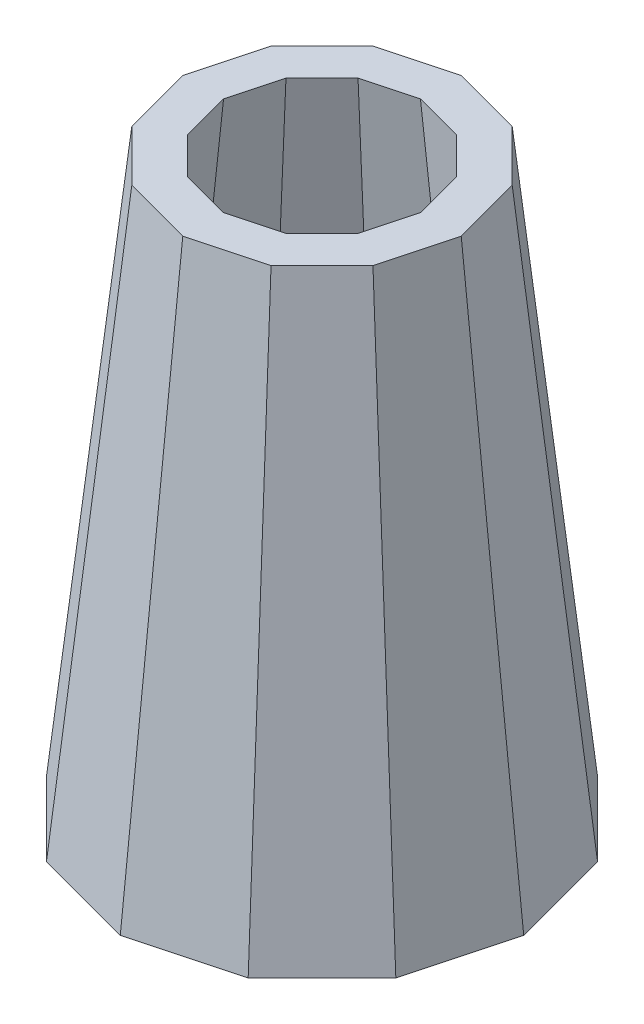
ISO-10303-21;
HEADER;
FILE_DESCRIPTION(('STEP AP214'),'2;1');
FILE_NAME('part.step','',(''),(''),'','','');
FILE_SCHEMA(('AUTOMOTIVE_DESIGN { 1 0 10303 214 1 1 1 1 }'));
ENDSEC;
DATA;
#1=APPLICATION_CONTEXT('core data for automotive mechanical design processes');
#2=APPLICATION_PROTOCOL_DEFINITION('international standard','automotive_design',2000,#1);
#3=PRODUCT_CONTEXT('',#1,'mechanical');
#4=PRODUCT('Part','Part','',(#3));
#5=PRODUCT_RELATED_PRODUCT_CATEGORY('part','',(#4));
#6=PRODUCT_DEFINITION_FORMATION('','',#4);
#7=PRODUCT_DEFINITION_CONTEXT('part definition',#1,'design');
#8=PRODUCT_DEFINITION('design','',#6,#7);
#9=PRODUCT_DEFINITION_SHAPE('','',#8);
#10=(LENGTH_UNIT() NAMED_UNIT(*) SI_UNIT(.MILLI.,.METRE.));
#11=(NAMED_UNIT(*) PLANE_ANGLE_UNIT() SI_UNIT($,.RADIAN.));
#12=(NAMED_UNIT(*) SI_UNIT($,.STERADIAN.) SOLID_ANGLE_UNIT());
#13=UNCERTAINTY_MEASURE_WITH_UNIT(LENGTH_MEASURE(1.E-05),#10,'distance_accuracy_value','');
#14=(GEOMETRIC_REPRESENTATION_CONTEXT(3) GLOBAL_UNCERTAINTY_ASSIGNED_CONTEXT((#13)) GLOBAL_UNIT_ASSIGNED_CONTEXT((#10,
#11,#12)) REPRESENTATION_CONTEXT('',''));
#15=CARTESIAN_POINT('',(0.,0.,0.));
#16=DIRECTION('',(0.,0.,1.));
#17=DIRECTION('',(1.,0.,0.));
#18=AXIS2_PLACEMENT_3D('',#15,#16,#17);
#19=CARTESIAN_POINT('',(84.9900564597618,0.,49.0690319754837));
#20=DIRECTION('',(0.960634383546173,0.104528463267653,0.257401207292754));
#21=DIRECTION('',(0.25881904510251,0.,-0.965925826289071));
#22=AXIS2_PLACEMENT_3D('',#19,#20,#21);
#23=PLANE('',#22);
#24=DIRECTION('',(0.25881904510251,0.,-0.965925826289071));
#25=VECTOR('',#24,1.);
#26=CARTESIAN_POINT('',(84.9900564597618,0.,49.0690319754837));
#27=LINE('',#26,#25);
#28=CARTESIAN_POINT('',(84.9900564597618,0.,49.0690319754837));
#29=VERTEX_POINT('',#28);
#30=CARTESIAN_POINT('',(98.1380639509693,0.,-1.08940634291343E-12));
#31=VERTEX_POINT('',#30);
#32=EDGE_CURVE('E288',#29,#31,#27,.T.);
#33=ORIENTED_EDGE('',*,*,#32,.T.);
#34=DIRECTION('',(0.108173407342293,-0.994132040497618,0.));
#35=VECTOR('',#34,1.);
#36=CARTESIAN_POINT('',(98.1380639509693,0.,-1.08940634291343E-12));
#37=LINE('',#36,#35);
#38=CARTESIAN_POINT('',(67.7360159530915,279.4,-7.45644531443626E-13));
#39=VERTEX_POINT('',#38);
#40=EDGE_CURVE('E11',#39,#31,#37,.T.);
#41=ORIENTED_EDGE('',*,*,#40,.F.);
#42=DIRECTION('',(-0.25881904510251,0.,0.965925826289071));
#43=VECTOR('',#42,1.);
#44=CARTESIAN_POINT('',(56.6245595142048,279.4,41.4685199760145));
#45=LINE('',#44,#43);
#46=CARTESIAN_POINT('',(58.6611105665257,279.4,33.8680079765451));
#47=VERTEX_POINT('',#46);
#48=EDGE_CURVE('E316',#47,#39,#45,.F.);
#49=ORIENTED_EDGE('',*,*,#48,.F.);
#50=DIRECTION('',(0.0936809187723488,-0.994132040497618,0.0540867036711456));
#51=VECTOR('',#50,1.);
#52=CARTESIAN_POINT('',(84.9900564597618,0.,49.0690319754837));
#53=LINE('',#52,#51);
#54=EDGE_CURVE('E318',#47,#29,#53,.T.);
#55=ORIENTED_EDGE('',*,*,#54,.T.);
#56=EDGE_LOOP('',(#33,#41,#49,#55));
#57=FACE_BOUND('',#56,.T.);
#58=ADVANCED_FACE('F35',(#57),#23,.T.);
#59=CARTESIAN_POINT('',(98.1380639509693,0.,-1.08940634291343E-12));
#60=DIRECTION('',(0.960634383546167,0.104528463267653,-0.257401207292776));
#61=DIRECTION('',(-0.258819045102531,0.,-0.965925826289065));
#62=AXIS2_PLACEMENT_3D('',#59,#60,#61);
#63=PLANE('',#62);
#64=DIRECTION('',(-0.258819045102531,0.,-0.965925826289065));
#65=VECTOR('',#64,1.);
#66=CARTESIAN_POINT('',(98.1380639509693,0.,-1.08940634291343E-12));
#67=LINE('',#66,#65);
#68=CARTESIAN_POINT('',(84.9900564597607,0.,-49.0690319754856));
#69=VERTEX_POINT('',#68);
#70=EDGE_CURVE('E291',#31,#69,#67,.T.);
#71=ORIENTED_EDGE('',*,*,#70,.T.);
#72=DIRECTION('',(0.0936809187723476,-0.994132040497618,-0.0540867036711477));
#73=VECTOR('',#72,1.);
#74=CARTESIAN_POINT('',(84.9900564597607,0.,-49.0690319754856));
#75=LINE('',#74,#73);
#76=CARTESIAN_POINT('',(58.6611105665249,279.4,-33.8680079765464));
#77=VERTEX_POINT('',#76);
#78=EDGE_CURVE('E45',#77,#69,#75,.T.);
#79=ORIENTED_EDGE('',*,*,#78,.F.);
#80=DIRECTION('',(0.258819045102531,0.,0.965925826289065));
#81=VECTOR('',#80,1.);
#82=CARTESIAN_POINT('',(69.7725670054125,279.4,7.60051199946867));
#83=LINE('',#82,#81);
#84=EDGE_CURVE('E357',#39,#77,#83,.F.);
#85=ORIENTED_EDGE('',*,*,#84,.F.);
#86=ORIENTED_EDGE('',*,*,#40,.T.);
#87=EDGE_LOOP('',(#71,#79,#85,#86));
#88=FACE_BOUND('',#87,.T.);
#89=ADVANCED_FACE('F37',(#88),#63,.T.);
#90=CARTESIAN_POINT('',(84.9900564597607,0.,-49.0690319754856));
#91=DIRECTION('',(0.703233176253396,0.104528463267653,-0.703233176253413));
#92=DIRECTION('',(-0.707106781186556,0.,-0.707106781186539));
#93=AXIS2_PLACEMENT_3D('',#90,#91,#92);
#94=PLANE('',#93);
#95=DIRECTION('',(-0.707106781186556,0.,-0.707106781186539));
#96=VECTOR('',#95,1.);
#97=CARTESIAN_POINT('',(84.9900564597607,0.,-49.0690319754856));
#98=LINE('',#97,#96);
#99=CARTESIAN_POINT('',(49.0690319754835,0.,-84.9900564597619));
#100=VERTEX_POINT('',#99);
#101=EDGE_CURVE('E294',#69,#100,#98,.T.);
#102=ORIENTED_EDGE('',*,*,#101,.T.);
#103=DIRECTION('',(0.0540867036711456,-0.994132040497618,-0.0936809187723488));
#104=VECTOR('',#103,1.);
#105=CARTESIAN_POINT('',(49.0690319754835,0.,-84.9900564597619));
#106=LINE('',#105,#104);
#107=CARTESIAN_POINT('',(33.8680079765449,279.4,-58.6611105665258));
#108=VERTEX_POINT('',#107);
#109=EDGE_CURVE('E349',#108,#100,#106,.T.);
#110=ORIENTED_EDGE('',*,*,#109,.F.);
#111=DIRECTION('',(0.707106781186556,0.,0.707106781186539));
#112=VECTOR('',#111,1.);
#113=CARTESIAN_POINT('',(64.2250715136735,279.4,-28.3040470293979));
#114=LINE('',#113,#112);
#115=EDGE_CURVE('E359',#77,#108,#114,.F.);
#116=ORIENTED_EDGE('',*,*,#115,.F.);
#117=ORIENTED_EDGE('',*,*,#78,.T.);
#118=EDGE_LOOP('',(#102,#110,#116,#117));
#119=FACE_BOUND('',#118,.T.);
#120=ADVANCED_FACE('F398',(#119),#94,.T.);
#121=CARTESIAN_POINT('',(49.0690319754835,0.,-84.9900564597619));
#122=DIRECTION('',(0.257401207292754,0.104528463267653,-0.960634383546173));
#123=DIRECTION('',(-0.965925826289071,0.,-0.25881904510251));
#124=AXIS2_PLACEMENT_3D('',#121,#122,#123);
#125=PLANE('',#124);
#126=DIRECTION('',(-0.965925826289071,0.,-0.25881904510251));
#127=VECTOR('',#126,1.);
#128=CARTESIAN_POINT('',(49.0690319754835,0.,-84.9900564597619));
#129=LINE('',#128,#127);
#130=CARTESIAN_POINT('',(-1.15194854481231E-12,0.,-98.1380639509694));
#131=VERTEX_POINT('',#130);
#132=EDGE_CURVE('E296',#100,#131,#129,.T.);
#133=ORIENTED_EDGE('',*,*,#132,.T.);
#134=DIRECTION('',(0.,-0.994132040497618,-0.108173407342293));
#135=VECTOR('',#134,1.);
#136=CARTESIAN_POINT('',(-1.15531823272913E-12,0.,-98.1380639509694));
#137=LINE('',#136,#135);
#138=CARTESIAN_POINT('',(-7.87140091823943E-13,279.4,-67.7360159530916));
#139=VERTEX_POINT('',#138);
#140=EDGE_CURVE('E346',#139,#131,#137,.T.);
#141=ORIENTED_EDGE('',*,*,#140,.F.);
#142=DIRECTION('',(0.965925826289071,0.,0.25881904510251));
#143=VECTOR('',#142,1.);
#144=CARTESIAN_POINT('',(41.4685199760144,279.4,-56.624559514205));
#145=LINE('',#144,#143);
#146=EDGE_CURVE('E361',#108,#139,#145,.F.);
#147=ORIENTED_EDGE('',*,*,#146,.F.);
#148=ORIENTED_EDGE('',*,*,#109,.T.);
#149=EDGE_LOOP('',(#133,#141,#147,#148));
#150=FACE_BOUND('',#149,.T.);
#151=ADVANCED_FACE('F402',(#150),#125,.T.);
#152=CARTESIAN_POINT('',(-1.15194854481231E-12,0.,-98.1380639509694));
#153=DIRECTION('',(-0.257401207292778,0.104528463267653,-0.960634383546167));
#154=DIRECTION('',(-0.965925826289065,0.,0.258819045102533));
#155=AXIS2_PLACEMENT_3D('',#152,#153,#154);
#156=PLANE('',#155);
#157=DIRECTION('',(-0.965925826289065,0.,0.258819045102533));
#158=VECTOR('',#157,1.);
#159=CARTESIAN_POINT('',(-1.15194854481231E-12,0.,-98.1380639509694));
#160=LINE('',#159,#158);
#161=CARTESIAN_POINT('',(-49.0690319754856,0.,-84.9900564597607));
#162=VERTEX_POINT('',#161);
#163=EDGE_CURVE('E299',#131,#162,#160,.T.);
#164=ORIENTED_EDGE('',*,*,#163,.T.);
#165=DIRECTION('',(-0.0540867036711478,-0.994132040497618,-0.0936809187723475));
#166=VECTOR('',#165,1.);
#167=CARTESIAN_POINT('',(-49.0690319754856,0.,-84.9900564597607));
#168=LINE('',#167,#166);
#169=CARTESIAN_POINT('',(-33.8680079765464,279.4,-58.6611105665249));
#170=VERTEX_POINT('',#169);
#171=EDGE_CURVE('E343',#170,#162,#168,.T.);
#172=ORIENTED_EDGE('',*,*,#171,.F.);
#173=DIRECTION('',(0.965925826289065,0.,-0.258819045102533));
#174=VECTOR('',#173,1.);
#175=CARTESIAN_POINT('',(7.60051199946865,279.4,-69.7725670054126));
#176=LINE('',#175,#174);
#177=EDGE_CURVE('E363',#139,#170,#176,.F.);
#178=ORIENTED_EDGE('',*,*,#177,.F.);
#179=ORIENTED_EDGE('',*,*,#140,.T.);
#180=EDGE_LOOP('',(#164,#172,#178,#179));
#181=FACE_BOUND('',#180,.T.);
#182=ADVANCED_FACE('F407',(#181),#156,.T.);
#183=CARTESIAN_POINT('',(-49.0690319754856,0.,-84.9900564597607));
#184=DIRECTION('',(-0.703233176253413,0.104528463267653,-0.703233176253396));
#185=DIRECTION('',(-0.707106781186539,0.,0.707106781186556));
#186=AXIS2_PLACEMENT_3D('',#183,#184,#185);
#187=PLANE('',#186);
#188=DIRECTION('',(-0.707106781186539,0.,0.707106781186556));
#189=VECTOR('',#188,1.);
#190=CARTESIAN_POINT('',(-49.0690319754856,0.,-84.9900564597607));
#191=LINE('',#190,#189);
#192=CARTESIAN_POINT('',(-84.9900564597618,0.,-49.0690319754837));
#193=VERTEX_POINT('',#192);
#194=EDGE_CURVE('E301',#162,#193,#191,.T.);
#195=ORIENTED_EDGE('',*,*,#194,.T.);
#196=DIRECTION('',(-0.0936809187723488,-0.994132040497618,-0.0540867036711456));
#197=VECTOR('',#196,1.);
#198=CARTESIAN_POINT('',(-84.9900564597618,0.,-49.0690319754837));
#199=LINE('',#198,#197);
#200=CARTESIAN_POINT('',(-58.6611105665257,279.4,-33.8680079765451));
#201=VERTEX_POINT('',#200);
#202=EDGE_CURVE('E340',#201,#193,#199,.T.);
#203=ORIENTED_EDGE('',*,*,#202,.F.);
#204=DIRECTION('',(0.707106781186539,0.,-0.707106781186556));
#205=VECTOR('',#204,1.);
#206=CARTESIAN_POINT('',(-28.3040470293979,279.4,-64.2250715136735));
#207=LINE('',#206,#205);
#208=EDGE_CURVE('E365',#170,#201,#207,.F.);
#209=ORIENTED_EDGE('',*,*,#208,.F.);
#210=ORIENTED_EDGE('',*,*,#171,.T.);
#211=EDGE_LOOP('',(#195,#203,#209,#210));
#212=FACE_BOUND('',#211,.T.);
#213=ADVANCED_FACE('F413',(#212),#187,.T.);
#214=CARTESIAN_POINT('',(-84.9900564597618,0.,-49.0690319754837));
#215=DIRECTION('',(-0.960634383546173,0.104528463267653,-0.257401207292755));
#216=DIRECTION('',(-0.25881904510251,0.,0.965925826289071));
#217=AXIS2_PLACEMENT_3D('',#214,#215,#216);
#218=PLANE('',#217);
#219=DIRECTION('',(-0.25881904510251,0.,0.965925826289071));
#220=VECTOR('',#219,1.);
#221=CARTESIAN_POINT('',(-84.9900564597618,0.,-49.0690319754837));
#222=LINE('',#221,#220);
#223=CARTESIAN_POINT('',(-98.1380639509694,0.,1.14965619313282E-12));
#224=VERTEX_POINT('',#223);
#225=EDGE_CURVE('E303',#193,#224,#222,.T.);
#226=ORIENTED_EDGE('',*,*,#225,.T.);
#227=DIRECTION('',(-0.108173407342293,-0.994132040497618,0.));
#228=VECTOR('',#227,1.);
#229=CARTESIAN_POINT('',(-98.1380639509694,0.,1.14965619313282E-12));
#230=LINE('',#229,#228);
#231=CARTESIAN_POINT('',(-67.7360159530916,279.4,8.02551515723469E-13));
#232=VERTEX_POINT('',#231);
#233=EDGE_CURVE('E336',#232,#224,#230,.T.);
#234=ORIENTED_EDGE('',*,*,#233,.F.);
#235=DIRECTION('',(0.25881904510251,0.,-0.965925826289071));
#236=VECTOR('',#235,1.);
#237=CARTESIAN_POINT('',(-56.6245595142049,279.4,-41.4685199760145));
#238=LINE('',#237,#236);
#239=EDGE_CURVE('E368',#201,#232,#238,.F.);
#240=ORIENTED_EDGE('',*,*,#239,.F.);
#241=ORIENTED_EDGE('',*,*,#202,.T.);
#242=EDGE_LOOP('',(#226,#234,#240,#241));
#243=FACE_BOUND('',#242,.T.);
#244=ADVANCED_FACE('F417',(#243),#218,.T.);
#245=CARTESIAN_POINT('',(-98.1380639509694,0.,1.14965619313282E-12));
#246=DIRECTION('',(-0.960634383546167,0.104528463267653,0.257401207292777));
#247=DIRECTION('',(0.258819045102532,0.,0.965925826289065));
#248=AXIS2_PLACEMENT_3D('',#245,#246,#247);
#249=PLANE('',#248);
#250=DIRECTION('',(0.258819045102532,0.,0.965925826289065));
#251=VECTOR('',#250,1.);
#252=CARTESIAN_POINT('',(-98.1380639509694,0.,1.14965619313282E-12));
#253=LINE('',#252,#251);
#254=CARTESIAN_POINT('',(-84.9900564597607,0.,49.0690319754856));
#255=VERTEX_POINT('',#254);
#256=EDGE_CURVE('E306',#224,#255,#253,.T.);
#257=ORIENTED_EDGE('',*,*,#256,.T.);
#258=DIRECTION('',(-0.0936809187723475,-0.994132040497618,0.0540867036711478));
#259=VECTOR('',#258,1.);
#260=CARTESIAN_POINT('',(-84.9900564597607,0.,49.0690319754856));
#261=LINE('',#260,#259);
#262=CARTESIAN_POINT('',(-58.6611105665249,279.4,33.8680079765464));
#263=VERTEX_POINT('',#262);
#264=EDGE_CURVE('E333',#263,#255,#261,.T.);
#265=ORIENTED_EDGE('',*,*,#264,.F.);
#266=DIRECTION('',(-0.258819045102532,0.,-0.965925826289065));
#267=VECTOR('',#266,1.);
#268=CARTESIAN_POINT('',(-69.7725670054126,279.4,-7.60051199946864));
#269=LINE('',#268,#267);
#270=EDGE_CURVE('E370',#232,#263,#269,.F.);
#271=ORIENTED_EDGE('',*,*,#270,.F.);
#272=ORIENTED_EDGE('',*,*,#233,.T.);
#273=EDGE_LOOP('',(#257,#265,#271,#272));
#274=FACE_BOUND('',#273,.T.);
#275=ADVANCED_FACE('F422',(#274),#249,.T.);
#276=CARTESIAN_POINT('',(-84.9900564597607,0.,49.0690319754856));
#277=DIRECTION('',(-0.703233176253396,0.104528463267653,0.703233176253412));
#278=DIRECTION('',(0.707106781186556,0.,0.707106781186539));
#279=AXIS2_PLACEMENT_3D('',#276,#277,#278);
#280=PLANE('',#279);
#281=DIRECTION('',(0.707106781186556,0.,0.707106781186539));
#282=VECTOR('',#281,1.);
#283=CARTESIAN_POINT('',(-84.9900564597607,0.,49.0690319754856));
#284=LINE('',#283,#282);
#285=CARTESIAN_POINT('',(-49.0690319754837,0.,84.9900564597618));
#286=VERTEX_POINT('',#285);
#287=EDGE_CURVE('E308',#255,#286,#284,.T.);
#288=ORIENTED_EDGE('',*,*,#287,.T.);
#289=DIRECTION('',(-0.0540867036711456,-0.994132040497618,0.0936809187723488));
#290=VECTOR('',#289,1.);
#291=CARTESIAN_POINT('',(-49.0690319754837,0.,84.9900564597618));
#292=LINE('',#291,#290);
#293=CARTESIAN_POINT('',(-33.8680079765451,279.4,58.6611105665257));
#294=VERTEX_POINT('',#293);
#295=EDGE_CURVE('E329',#294,#286,#292,.T.);
#296=ORIENTED_EDGE('',*,*,#295,.F.);
#297=DIRECTION('',(-0.707106781186556,0.,-0.707106781186539));
#298=VECTOR('',#297,1.);
#299=CARTESIAN_POINT('',(-64.2250715136735,279.4,28.3040470293979));
#300=LINE('',#299,#298);
#301=EDGE_CURVE('E372',#263,#294,#300,.F.);
#302=ORIENTED_EDGE('',*,*,#301,.F.);
#303=ORIENTED_EDGE('',*,*,#264,.T.);
#304=EDGE_LOOP('',(#288,#296,#302,#303));
#305=FACE_BOUND('',#304,.T.);
#306=ADVANCED_FACE('F428',(#305),#280,.T.);
#307=CARTESIAN_POINT('',(-49.0690319754837,0.,84.9900564597618));
#308=DIRECTION('',(-0.257401207292755,0.104528463267653,0.960634383546172));
#309=DIRECTION('',(0.965925826289071,0.,0.25881904510251));
#310=AXIS2_PLACEMENT_3D('',#307,#308,#309);
#311=PLANE('',#310);
#312=DIRECTION('',(0.965925826289071,0.,0.25881904510251));
#313=VECTOR('',#312,1.);
#314=CARTESIAN_POINT('',(-49.0690319754837,0.,84.9900564597618));
#315=LINE('',#314,#313);
#316=CARTESIAN_POINT('',(1.09077713337527E-12,0.,98.1380639509693));
#317=VERTEX_POINT('',#316);
#318=EDGE_CURVE('E310',#286,#317,#315,.T.);
#319=ORIENTED_EDGE('',*,*,#318,.T.);
#320=DIRECTION('',(0.,-0.994132040497618,0.108173407342293));
#321=VECTOR('',#320,1.);
#322=CARTESIAN_POINT('',(1.09077713337527E-12,0.,98.1380639509693));
#323=LINE('',#322,#321);
#324=CARTESIAN_POINT('',(7.54030869078314E-13,279.4,67.7360159530916));
#325=VERTEX_POINT('',#324);
#326=EDGE_CURVE('E325',#325,#317,#323,.T.);
#327=ORIENTED_EDGE('',*,*,#326,.F.);
#328=DIRECTION('',(-0.965925826289071,0.,-0.25881904510251));
#329=VECTOR('',#328,1.);
#330=CARTESIAN_POINT('',(-41.4685199760145,279.4,56.6245595142048));
#331=LINE('',#330,#329);
#332=EDGE_CURVE('E375',#294,#325,#331,.F.);
#333=ORIENTED_EDGE('',*,*,#332,.F.);
#334=ORIENTED_EDGE('',*,*,#295,.T.);
#335=EDGE_LOOP('',(#319,#327,#333,#334));
#336=FACE_BOUND('',#335,.T.);
#337=ADVANCED_FACE('F432',(#336),#311,.T.);
#338=CARTESIAN_POINT('',(1.09077713337527E-12,0.,98.1380639509693));
#339=DIRECTION('',(0.257401207292777,0.104528463267653,0.960634383546167));
#340=DIRECTION('',(0.965925826289065,0.,-0.258819045102532));
#341=AXIS2_PLACEMENT_3D('',#338,#339,#340);
#342=PLANE('',#341);
#343=DIRECTION('',(0.965925826289065,0.,-0.258819045102532));
#344=VECTOR('',#343,1.);
#345=CARTESIAN_POINT('',(1.09077713337527E-12,0.,98.1380639509693));
#346=LINE('',#345,#344);
#347=CARTESIAN_POINT('',(49.0690319754856,0.,84.9900564597607));
#348=VERTEX_POINT('',#347);
#349=EDGE_CURVE('E313',#317,#348,#346,.T.);
#350=ORIENTED_EDGE('',*,*,#349,.T.);
#351=DIRECTION('',(0.0540867036711478,-0.994132040497618,0.0936809187723475));
#352=VECTOR('',#351,1.);
#353=CARTESIAN_POINT('',(49.0690319754856,0.,84.9900564597607));
#354=LINE('',#353,#352);
#355=CARTESIAN_POINT('',(33.8680079765464,279.4,58.6611105665249));
#356=VERTEX_POINT('',#355);
#357=EDGE_CURVE('E321',#356,#348,#354,.T.);
#358=ORIENTED_EDGE('',*,*,#357,.F.);
#359=DIRECTION('',(-0.965925826289065,0.,0.258819045102532));
#360=VECTOR('',#359,1.);
#361=CARTESIAN_POINT('',(-7.60051199946869,279.4,69.7725670054125));
#362=LINE('',#361,#360);
#363=EDGE_CURVE('E377',#325,#356,#362,.F.);
#364=ORIENTED_EDGE('',*,*,#363,.F.);
#365=ORIENTED_EDGE('',*,*,#326,.T.);
#366=EDGE_LOOP('',(#350,#358,#364,#365));
#367=FACE_BOUND('',#366,.T.);
#368=ADVANCED_FACE('F435',(#367),#342,.T.);
#369=CARTESIAN_POINT('',(49.0690319754856,0.,84.9900564597607));
#370=DIRECTION('',(0.703233176253412,0.104528463267653,0.703233176253396));
#371=DIRECTION('',(0.707106781186539,0.,-0.707106781186556));
#372=AXIS2_PLACEMENT_3D('',#369,#370,#371);
#373=PLANE('',#372);
#374=DIRECTION('',(0.707106781186539,0.,-0.707106781186556));
#375=VECTOR('',#374,1.);
#376=CARTESIAN_POINT('',(49.0690319754856,0.,84.9900564597607));
#377=LINE('',#376,#375);
#378=EDGE_CURVE('E315',#348,#29,#377,.T.);
#379=ORIENTED_EDGE('',*,*,#378,.T.);
#380=ORIENTED_EDGE('',*,*,#54,.F.);
#381=DIRECTION('',(-0.707106781186539,0.,0.707106781186556));
#382=VECTOR('',#381,1.);
#383=CARTESIAN_POINT('',(28.3040470293979,279.4,64.2250715136735));
#384=LINE('',#383,#382);
#385=EDGE_CURVE('E39',#356,#47,#384,.F.);
#386=ORIENTED_EDGE('',*,*,#385,.F.);
#387=ORIENTED_EDGE('',*,*,#357,.T.);
#388=EDGE_LOOP('',(#379,#380,#386,#387));
#389=FACE_BOUND('',#388,.T.);
#390=ADVANCED_FACE('F387',(#389),#373,.T.);
#391=CARTESIAN_POINT('',(0.,279.4,0.));
#392=DIRECTION('',(0.,1.,0.));
#393=DIRECTION('',(0.,0.,1.));
#394=AXIS2_PLACEMENT_3D('',#391,#392,#393);
#395=PLANE('',#394);
#396=DIRECTION('',(-0.25881904510251,0.,0.965925826289071));
#397=VECTOR('',#396,1.);
#398=CARTESIAN_POINT('',(38.122315293636,279.4,36.5108585789499));
#399=LINE('',#398,#397);
#400=CARTESIAN_POINT('',(41.4872677136472,279.4,23.9526851824156));
#401=VERTEX_POINT('',#400);
#402=CARTESIAN_POINT('',(47.9053703648323,279.4,-5.14131474739469E-13));
#403=VERTEX_POINT('',#402);
#404=EDGE_CURVE('E227',#401,#403,#399,.F.);
#405=ORIENTED_EDGE('',*,*,#404,.F.);
#406=DIRECTION('',(-0.707106781186539,0.,0.707106781186556));
#407=VECTOR('',#406,1.);
#408=CARTESIAN_POINT('',(14.7594642058938,279.4,50.6804886901697));
#409=LINE('',#408,#407);
#410=CARTESIAN_POINT('',(23.9526851824166,279.4,41.4872677136467));
#411=VERTEX_POINT('',#410);
#412=EDGE_CURVE('E205',#411,#401,#409,.F.);
#413=ORIENTED_EDGE('',*,*,#412,.F.);
#414=DIRECTION('',(-0.965925826289065,0.,0.258819045102532));
#415=VECTOR('',#414,1.);
#416=CARTESIAN_POINT('',(-12.5581733965337,279.4,51.2703227848438));
#417=LINE('',#416,#415);
#418=CARTESIAN_POINT('',(5.22517812374158E-13,279.4,47.9053703648323));
#419=VERTEX_POINT('',#418);
#420=EDGE_CURVE('E284',#419,#411,#417,.F.);
#421=ORIENTED_EDGE('',*,*,#420,.F.);
#422=DIRECTION('',(-0.965925826289071,0.,-0.25881904510251));
#423=VECTOR('',#422,1.);
#424=CARTESIAN_POINT('',(-36.5108585789499,279.4,38.122315293636));
#425=LINE('',#424,#423);
#426=CARTESIAN_POINT('',(-23.9526851824157,279.4,41.4872677136472));
#427=VERTEX_POINT('',#426);
#428=EDGE_CURVE('E281',#427,#419,#425,.F.);
#429=ORIENTED_EDGE('',*,*,#428,.F.);
#430=DIRECTION('',(-0.707106781186556,0.,-0.707106781186539));
#431=VECTOR('',#430,1.);
#432=CARTESIAN_POINT('',(-50.6804886901697,279.4,14.7594642058938));
#433=LINE('',#432,#431);
#434=CARTESIAN_POINT('',(-41.4872677136467,279.4,23.9526851824166));
#435=VERTEX_POINT('',#434);
#436=EDGE_CURVE('E279',#435,#427,#433,.F.);
#437=ORIENTED_EDGE('',*,*,#436,.F.);
#438=DIRECTION('',(-0.258819045102532,0.,-0.965925826289065));
#439=VECTOR('',#438,1.);
#440=CARTESIAN_POINT('',(-51.2703227848438,279.4,-12.5581733965337));
#441=LINE('',#440,#439);
#442=CARTESIAN_POINT('',(-47.9053703648323,279.4,5.71038459019313E-13));
#443=VERTEX_POINT('',#442);
#444=EDGE_CURVE('E276',#443,#435,#441,.F.);
#445=ORIENTED_EDGE('',*,*,#444,.F.);
#446=DIRECTION('',(0.25881904510251,0.,-0.965925826289071));
#447=VECTOR('',#446,1.);
#448=CARTESIAN_POINT('',(-38.122315293636,279.4,-36.5108585789499));
#449=LINE('',#448,#447);
#450=CARTESIAN_POINT('',(-41.4872677136473,279.4,-23.9526851824156));
#451=VERTEX_POINT('',#450);
#452=EDGE_CURVE('E274',#451,#443,#449,.F.);
#453=ORIENTED_EDGE('',*,*,#452,.F.);
#454=DIRECTION('',(0.707106781186539,0.,-0.707106781186556));
#455=VECTOR('',#454,1.);
#456=CARTESIAN_POINT('',(-14.7594642058938,279.4,-50.6804886901697));
#457=LINE('',#456,#455);
#458=CARTESIAN_POINT('',(-23.9526851824166,279.4,-41.4872677136467));
#459=VERTEX_POINT('',#458);
#460=EDGE_CURVE('E271',#459,#451,#457,.F.);
#461=ORIENTED_EDGE('',*,*,#460,.F.);
#462=DIRECTION('',(0.965925826289065,0.,-0.258819045102533));
#463=VECTOR('',#462,1.);
#464=CARTESIAN_POINT('',(12.5581733965337,279.4,-51.2703227848439));
#465=LINE('',#464,#463);
#466=CARTESIAN_POINT('',(-5.55627035119787E-13,279.4,-47.9053703648323));
#467=VERTEX_POINT('',#466);
#468=EDGE_CURVE('E269',#467,#459,#465,.F.);
#469=ORIENTED_EDGE('',*,*,#468,.F.);
#470=DIRECTION('',(0.965925826289071,0.,0.25881904510251));
#471=VECTOR('',#470,1.);
#472=CARTESIAN_POINT('',(36.5108585789498,279.4,-38.1223152936361));
#473=LINE('',#472,#471);
#474=CARTESIAN_POINT('',(23.9526851824155,279.4,-41.4872677136473));
#475=VERTEX_POINT('',#474);
#476=EDGE_CURVE('E267',#475,#467,#473,.F.);
#477=ORIENTED_EDGE('',*,*,#476,.F.);
#478=DIRECTION('',(0.707106781186556,0.,0.707106781186539));
#479=VECTOR('',#478,1.);
#480=CARTESIAN_POINT('',(50.6804886901697,279.4,-14.7594642058938));
#481=LINE('',#480,#479);
#482=CARTESIAN_POINT('',(41.4872677136467,279.4,-23.9526851824166));
#483=VERTEX_POINT('',#482);
#484=EDGE_CURVE('E265',#483,#475,#481,.F.);
#485=ORIENTED_EDGE('',*,*,#484,.F.);
#486=DIRECTION('',(0.258819045102531,0.,0.965925826289065));
#487=VECTOR('',#486,1.);
#488=CARTESIAN_POINT('',(51.2703227848437,279.4,12.5581733965337));
#489=LINE('',#488,#487);
#490=EDGE_CURVE('E233',#403,#483,#489,.F.);
#491=ORIENTED_EDGE('',*,*,#490,.F.);
#492=EDGE_LOOP('',(#405,#413,#421,#429,#437,#445,#453,#461,#469,#477,#485,#491));
#493=FACE_BOUND('',#492,.T.);
#494=ORIENTED_EDGE('',*,*,#48,.T.);
#495=ORIENTED_EDGE('',*,*,#84,.T.);
#496=ORIENTED_EDGE('',*,*,#115,.T.);
#497=ORIENTED_EDGE('',*,*,#146,.T.);
#498=ORIENTED_EDGE('',*,*,#177,.T.);
#499=ORIENTED_EDGE('',*,*,#208,.T.);
#500=ORIENTED_EDGE('',*,*,#239,.T.);
#501=ORIENTED_EDGE('',*,*,#270,.T.);
#502=ORIENTED_EDGE('',*,*,#301,.T.);
#503=ORIENTED_EDGE('',*,*,#332,.T.);
#504=ORIENTED_EDGE('',*,*,#363,.T.);
#505=ORIENTED_EDGE('',*,*,#385,.T.);
#506=EDGE_LOOP('',(#494,#495,#496,#497,#498,#499,#500,#501,#502,#503,#504,#505));
#507=FACE_BOUND('',#506,.T.);
#508=ADVANCED_FACE('F383',(#493,#507),#395,.T.);
#509=CARTESIAN_POINT('',(0.,0.,0.));
#510=DIRECTION('',(0.,1.,0.));
#511=DIRECTION('',(0.,0.,1.));
#512=AXIS2_PLACEMENT_3D('',#509,#510,#511);
#513=PLANE('',#512);
#514=DIRECTION('',(-0.707106781186539,0.,0.707106781186556));
#515=VECTOR('',#514,1.);
#516=CARTESIAN_POINT('',(35.5244491519815,0.,71.4454736362569));
#517=LINE('',#516,#515);
#518=CARTESIAN_POINT('',(39.1537091813558,0.,67.8162136068825));
#519=VERTEX_POINT('',#518);
#520=CARTESIAN_POINT('',(67.8162136068834,0.,39.1537091813542));
#521=VERTEX_POINT('',#520);
#522=EDGE_CURVE('E202',#519,#521,#517,.F.);
#523=ORIENTED_EDGE('',*,*,#522,.T.);
#524=DIRECTION('',(-0.25881904510251,0.,0.965925826289071));
#525=VECTOR('',#524,1.);
#526=CARTESIAN_POINT('',(66.487812239193,0.,44.1113705784191));
#527=LINE('',#526,#525);
#528=CARTESIAN_POINT('',(78.30741836271,0.,-8.6686984867976E-13));
#529=VERTEX_POINT('',#528);
#530=EDGE_CURVE('E212',#521,#529,#527,.F.);
#531=ORIENTED_EDGE('',*,*,#530,.T.);
#532=DIRECTION('',(0.258819045102531,0.,0.965925826289065));
#533=VECTOR('',#532,1.);
#534=CARTESIAN_POINT('',(79.6358197304005,0.,4.95766139706393));
#535=LINE('',#534,#533);
#536=CARTESIAN_POINT('',(67.8162136068825,0.,-39.1537091813558));
#537=VERTEX_POINT('',#536);
#538=EDGE_CURVE('E219',#529,#537,#535,.F.);
#539=ORIENTED_EDGE('',*,*,#538,.T.);
#540=DIRECTION('',(0.707106781186556,0.,0.707106781186539));
#541=VECTOR('',#540,1.);
#542=CARTESIAN_POINT('',(71.4454736362569,0.,-35.5244491519815));
#543=LINE('',#542,#541);
#544=CARTESIAN_POINT('',(39.1537091813541,0.,-67.8162136068835));
#545=VERTEX_POINT('',#544);
#546=EDGE_CURVE('E61',#537,#545,#543,.F.);
#547=ORIENTED_EDGE('',*,*,#546,.T.);
#548=DIRECTION('',(0.965925826289071,0.,0.25881904510251));
#549=VECTOR('',#548,1.);
#550=CARTESIAN_POINT('',(44.1113705784189,0.,-66.4878122391931));
#551=LINE('',#550,#549);
#552=CARTESIAN_POINT('',(-9.30399512208222E-13,0.,-78.3074183627101));
#553=VERTEX_POINT('',#552);
#554=EDGE_CURVE('E256',#545,#553,#551,.F.);
#555=ORIENTED_EDGE('',*,*,#554,.T.);
#556=DIRECTION('',(0.965925826289065,0.,-0.258819045102533));
#557=VECTOR('',#556,1.);
#558=CARTESIAN_POINT('',(4.95766139706389,0.,-79.6358197304007));
#559=LINE('',#558,#557);
#560=CARTESIAN_POINT('',(-39.1537091813558,0.,-67.8162136068825));
#561=VERTEX_POINT('',#560);
#562=EDGE_CURVE('E253',#553,#561,#559,.F.);
#563=ORIENTED_EDGE('',*,*,#562,.T.);
#564=DIRECTION('',(0.707106781186539,0.,-0.707106781186556));
#565=VECTOR('',#564,1.);
#566=CARTESIAN_POINT('',(-35.5244491519815,0.,-71.4454736362569));
#567=LINE('',#566,#565);
#568=CARTESIAN_POINT('',(-67.8162136068834,0.,-39.1537091813542));
#569=VERTEX_POINT('',#568);
#570=EDGE_CURVE('E250',#561,#569,#567,.F.);
#571=ORIENTED_EDGE('',*,*,#570,.T.);
#572=DIRECTION('',(0.25881904510251,0.,-0.965925826289071));
#573=VECTOR('',#572,1.);
#574=CARTESIAN_POINT('',(-66.487812239193,0.,-44.1113705784191));
#575=LINE('',#574,#573);
#576=CARTESIAN_POINT('',(-78.3074183627101,0.,9.16327160781419E-13));
#577=VERTEX_POINT('',#576);
#578=EDGE_CURVE('E246',#569,#577,#575,.F.);
#579=ORIENTED_EDGE('',*,*,#578,.T.);
#580=DIRECTION('',(-0.258819045102532,0.,-0.965925826289065));
#581=VECTOR('',#580,1.);
#582=CARTESIAN_POINT('',(-79.6358197304006,0.,-4.95766139706389));
#583=LINE('',#582,#581);
#584=CARTESIAN_POINT('',(-67.8162136068825,0.,39.1537091813558));
#585=VERTEX_POINT('',#584);
#586=EDGE_CURVE('E243',#577,#585,#583,.F.);
#587=ORIENTED_EDGE('',*,*,#586,.T.);
#588=DIRECTION('',(-0.707106781186556,0.,-0.707106781186539));
#589=VECTOR('',#588,1.);
#590=CARTESIAN_POINT('',(-71.4454736362569,0.,35.5244491519815));
#591=LINE('',#590,#589);
#592=CARTESIAN_POINT('',(-39.1537091813542,0.,67.8162136068834));
#593=VERTEX_POINT('',#592);
#594=EDGE_CURVE('E240',#585,#593,#591,.F.);
#595=ORIENTED_EDGE('',*,*,#594,.T.);
#596=DIRECTION('',(-0.965925826289071,0.,-0.25881904510251));
#597=VECTOR('',#596,1.);
#598=CARTESIAN_POINT('',(-44.1113705784191,0.,66.487812239193));
#599=LINE('',#598,#597);
#600=CARTESIAN_POINT('',(8.66279623843966E-13,0.,78.3074183627101));
#601=VERTEX_POINT('',#600);
#602=EDGE_CURVE('E235',#593,#601,#599,.F.);
#603=ORIENTED_EDGE('',*,*,#602,.T.);
#604=DIRECTION('',(-0.965925826289065,0.,0.258819045102532));
#605=VECTOR('',#604,1.);
#606=CARTESIAN_POINT('',(-4.95766139706394,0.,79.6358197304006));
#607=LINE('',#606,#605);
#608=EDGE_CURVE('E225',#601,#519,#607,.F.);
#609=ORIENTED_EDGE('',*,*,#608,.T.);
#610=EDGE_LOOP('',(#523,#531,#539,#547,#555,#563,#571,#579,#587,#595,#603,#609));
#611=FACE_BOUND('',#610,.T.);
#612=ORIENTED_EDGE('',*,*,#32,.F.);
#613=ORIENTED_EDGE('',*,*,#378,.F.);
#614=ORIENTED_EDGE('',*,*,#349,.F.);
#615=ORIENTED_EDGE('',*,*,#318,.F.);
#616=ORIENTED_EDGE('',*,*,#287,.F.);
#617=ORIENTED_EDGE('',*,*,#256,.F.);
#618=ORIENTED_EDGE('',*,*,#225,.F.);
#619=ORIENTED_EDGE('',*,*,#194,.F.);
#620=ORIENTED_EDGE('',*,*,#163,.F.);
#621=ORIENTED_EDGE('',*,*,#132,.F.);
#622=ORIENTED_EDGE('',*,*,#101,.F.);
#623=ORIENTED_EDGE('',*,*,#70,.F.);
#624=EDGE_LOOP('',(#612,#613,#614,#615,#616,#617,#618,#619,#620,#621,#622,#623));
#625=FACE_BOUND('',#624,.T.);
#626=ADVANCED_FACE('F221',(#611,#625),#513,.F.);
#627=CARTESIAN_POINT('',(66.6899714532072,-1.9912672252488,44.1655389765567));
#628=DIRECTION('',(0.960634383546173,0.104528463267653,0.257401207292754));
#629=DIRECTION('',(0.25881904510251,0.,-0.965925826289071));
#630=AXIS2_PLACEMENT_3D('',#627,#628,#629);
#631=PLANE('',#630);
#632=ORIENTED_EDGE('',*,*,#530,.F.);
#633=DIRECTION('',(0.0936809187723488,-0.994132040497618,0.0540867036711456));
#634=VECTOR('',#633,1.);
#635=CARTESIAN_POINT('',(68.017173089555,-2.13256085853676,39.2697331927709));
#636=LINE('',#635,#634);
#637=EDGE_CURVE('E198',#401,#521,#636,.T.);
#638=ORIENTED_EDGE('',*,*,#637,.F.);
#639=ORIENTED_EDGE('',*,*,#404,.T.);
#640=DIRECTION('',(0.108173407342293,-0.994132040497618,0.));
#641=VECTOR('',#640,1.);
#642=CARTESIAN_POINT('',(78.5394663855433,-2.13256085853676,-8.70831184940357E-13));
#643=LINE('',#642,#641);
#644=EDGE_CURVE('E215',#403,#529,#643,.T.);
#645=ORIENTED_EDGE('',*,*,#644,.T.);
#646=EDGE_LOOP('',(#632,#638,#639,#645));
#647=FACE_BOUND('',#646,.T.);
#648=ADVANCED_FACE('F213',(#647),#631,.F.);
#649=CARTESIAN_POINT('',(79.8379789444148,-1.9912672252488,4.9034929989263));
#650=DIRECTION('',(0.960634383546167,0.104528463267653,-0.257401207292776));
#651=DIRECTION('',(-0.258819045102531,0.,-0.965925826289065));
#652=AXIS2_PLACEMENT_3D('',#649,#650,#651);
#653=PLANE('',#652);
#654=ORIENTED_EDGE('',*,*,#538,.F.);
#655=ORIENTED_EDGE('',*,*,#644,.F.);
#656=ORIENTED_EDGE('',*,*,#490,.T.);
#657=DIRECTION('',(0.0936809187723476,-0.994132040497618,-0.0540867036711477));
#658=VECTOR('',#657,1.);
#659=CARTESIAN_POINT('',(68.0171730895541,-2.13256085853676,-39.2697331927725));
#660=LINE('',#659,#658);
#661=EDGE_CURVE('E547',#483,#537,#660,.T.);
#662=ORIENTED_EDGE('',*,*,#661,.T.);
#663=EDGE_LOOP('',(#654,#655,#656,#662));
#664=FACE_BOUND('',#663,.T.);
#665=ADVANCED_FACE('F442',(#664),#653,.F.);
#666=CARTESIAN_POINT('',(71.5934644521335,-1.9912672252488,-35.6724399678581));
#667=DIRECTION('',(0.703233176253396,0.104528463267653,-0.703233176253413));
#668=DIRECTION('',(-0.707106781186556,0.,-0.707106781186539));
#669=AXIS2_PLACEMENT_3D('',#666,#667,#668);
#670=PLANE('',#669);
#671=ORIENTED_EDGE('',*,*,#546,.F.);
#672=ORIENTED_EDGE('',*,*,#661,.F.);
#673=ORIENTED_EDGE('',*,*,#484,.T.);
#674=DIRECTION('',(0.0540867036711456,-0.994132040497618,-0.0936809187723488));
#675=VECTOR('',#674,1.);
#676=CARTESIAN_POINT('',(39.2697331927707,-2.13256085853676,-68.0171730895551));
#677=LINE('',#676,#675);
#678=EDGE_CURVE('E530',#475,#545,#677,.T.);
#679=ORIENTED_EDGE('',*,*,#678,.T.);
#680=EDGE_LOOP('',(#671,#672,#673,#679));
#681=FACE_BOUND('',#680,.T.);
#682=ADVANCED_FACE('F605',(#681),#670,.F.);
#683=CARTESIAN_POINT('',(44.1655389765565,-1.9912672252488,-66.6899714532073));
#684=DIRECTION('',(0.257401207292754,0.104528463267653,-0.960634383546173));
#685=DIRECTION('',(-0.965925826289071,0.,-0.25881904510251));
#686=AXIS2_PLACEMENT_3D('',#683,#684,#685);
#687=PLANE('',#686);
#688=ORIENTED_EDGE('',*,*,#554,.F.);
#689=ORIENTED_EDGE('',*,*,#678,.F.);
#690=ORIENTED_EDGE('',*,*,#476,.T.);
#691=DIRECTION('',(0.,-0.994132040497618,-0.108173407342293));
#692=VECTOR('',#691,1.);
#693=CARTESIAN_POINT('',(-9.30679144861557E-13,-2.13256085853676,-78.5394663855434));
#694=LINE('',#693,#692);
#695=EDGE_CURVE('E528',#467,#553,#694,.T.);
#696=ORIENTED_EDGE('',*,*,#695,.T.);
#697=EDGE_LOOP('',(#688,#689,#690,#696));
#698=FACE_BOUND('',#697,.T.);
#699=ADVANCED_FACE('F575',(#698),#687,.F.);
#700=CARTESIAN_POINT('',(4.90349299892626,-1.9912672252488,-79.8379789444149));
#701=DIRECTION('',(-0.257401207292778,0.104528463267653,-0.960634383546167));
#702=DIRECTION('',(-0.965925826289065,0.,0.258819045102533));
#703=AXIS2_PLACEMENT_3D('',#700,#701,#702);
#704=PLANE('',#703);
#705=ORIENTED_EDGE('',*,*,#562,.F.);
#706=ORIENTED_EDGE('',*,*,#695,.F.);
#707=ORIENTED_EDGE('',*,*,#468,.T.);
#708=DIRECTION('',(-0.0540867036711478,-0.994132040497618,-0.0936809187723475));
#709=VECTOR('',#708,1.);
#710=CARTESIAN_POINT('',(-39.2697331927725,-2.13256085853676,-68.0171730895541));
#711=LINE('',#710,#709);
#712=EDGE_CURVE('E531',#459,#561,#711,.T.);
#713=ORIENTED_EDGE('',*,*,#712,.T.);
#714=EDGE_LOOP('',(#705,#706,#707,#713));
#715=FACE_BOUND('',#714,.T.);
#716=ADVANCED_FACE('F580',(#715),#704,.F.);
#717=CARTESIAN_POINT('',(-35.6724399678581,-1.9912672252488,-71.5934644521335));
#718=DIRECTION('',(-0.703233176253413,0.104528463267653,-0.703233176253396));
#719=DIRECTION('',(-0.707106781186539,0.,0.707106781186556));
#720=AXIS2_PLACEMENT_3D('',#717,#718,#719);
#721=PLANE('',#720);
#722=ORIENTED_EDGE('',*,*,#570,.F.);
#723=ORIENTED_EDGE('',*,*,#712,.F.);
#724=ORIENTED_EDGE('',*,*,#460,.T.);
#725=DIRECTION('',(-0.0936809187723488,-0.994132040497618,-0.0540867036711456));
#726=VECTOR('',#725,1.);
#727=CARTESIAN_POINT('',(-68.017173089555,-2.13256085853676,-39.2697331927709));
#728=LINE('',#727,#726);
#729=EDGE_CURVE('E543',#451,#569,#728,.T.);
#730=ORIENTED_EDGE('',*,*,#729,.T.);
#731=EDGE_LOOP('',(#722,#723,#724,#730));
#732=FACE_BOUND('',#731,.T.);
#733=ADVANCED_FACE('F585',(#732),#721,.F.);
#734=CARTESIAN_POINT('',(-66.6899714532073,-1.9912672252488,-44.1655389765567));
#735=DIRECTION('',(-0.960634383546173,0.104528463267653,-0.257401207292755));
#736=DIRECTION('',(-0.25881904510251,0.,0.965925826289071));
#737=AXIS2_PLACEMENT_3D('',#734,#735,#736);
#738=PLANE('',#737);
#739=ORIENTED_EDGE('',*,*,#578,.F.);
#740=ORIENTED_EDGE('',*,*,#729,.F.);
#741=ORIENTED_EDGE('',*,*,#452,.T.);
#742=DIRECTION('',(-0.108173407342293,-0.994132040497618,0.));
#743=VECTOR('',#742,1.);
#744=CARTESIAN_POINT('',(-78.5394663855434,-2.13256085853676,9.16801357053743E-13));
#745=LINE('',#744,#743);
#746=EDGE_CURVE('E540',#443,#577,#745,.T.);
#747=ORIENTED_EDGE('',*,*,#746,.T.);
#748=EDGE_LOOP('',(#739,#740,#741,#747));
#749=FACE_BOUND('',#748,.T.);
#750=ADVANCED_FACE('F590',(#749),#738,.F.);
#751=CARTESIAN_POINT('',(-79.8379789444149,-1.9912672252488,-4.90349299892626));
#752=DIRECTION('',(-0.960634383546167,0.104528463267653,0.257401207292777));
#753=DIRECTION('',(0.258819045102532,0.,0.965925826289065));
#754=AXIS2_PLACEMENT_3D('',#751,#752,#753);
#755=PLANE('',#754);
#756=ORIENTED_EDGE('',*,*,#586,.F.);
#757=ORIENTED_EDGE('',*,*,#746,.F.);
#758=ORIENTED_EDGE('',*,*,#444,.T.);
#759=DIRECTION('',(-0.0936809187723475,-0.994132040497618,0.0540867036711478));
#760=VECTOR('',#759,1.);
#761=CARTESIAN_POINT('',(-68.0171730895541,-2.13256085853676,39.2697331927724));
#762=LINE('',#761,#760);
#763=EDGE_CURVE('E544',#435,#585,#762,.T.);
#764=ORIENTED_EDGE('',*,*,#763,.T.);
#765=EDGE_LOOP('',(#756,#757,#758,#764));
#766=FACE_BOUND('',#765,.T.);
#767=ADVANCED_FACE('F595',(#766),#755,.F.);
#768=CARTESIAN_POINT('',(-71.5934644521335,-1.9912672252488,35.6724399678581));
#769=DIRECTION('',(-0.703233176253396,0.104528463267653,0.703233176253412));
#770=DIRECTION('',(0.707106781186556,0.,0.707106781186539));
#771=AXIS2_PLACEMENT_3D('',#768,#769,#770);
#772=PLANE('',#771);
#773=ORIENTED_EDGE('',*,*,#594,.F.);
#774=ORIENTED_EDGE('',*,*,#763,.F.);
#775=ORIENTED_EDGE('',*,*,#436,.T.);
#776=DIRECTION('',(-0.0540867036711456,-0.994132040497618,0.0936809187723488));
#777=VECTOR('',#776,1.);
#778=CARTESIAN_POINT('',(-39.2697331927709,-2.13256085853676,68.017173089555));
#779=LINE('',#778,#777);
#780=EDGE_CURVE('E558',#427,#593,#779,.T.);
#781=ORIENTED_EDGE('',*,*,#780,.T.);
#782=EDGE_LOOP('',(#773,#774,#775,#781));
#783=FACE_BOUND('',#782,.T.);
#784=ADVANCED_FACE('F600',(#783),#772,.F.);
#785=CARTESIAN_POINT('',(-44.1655389765567,-1.9912672252488,66.6899714532072));
#786=DIRECTION('',(-0.257401207292755,0.104528463267653,0.960634383546172));
#787=DIRECTION('',(0.965925826289071,0.,0.25881904510251));
#788=AXIS2_PLACEMENT_3D('',#785,#786,#787);
#789=PLANE('',#788);
#790=ORIENTED_EDGE('',*,*,#602,.F.);
#791=ORIENTED_EDGE('',*,*,#780,.F.);
#792=ORIENTED_EDGE('',*,*,#428,.T.);
#793=DIRECTION('',(0.,-0.994132040497618,0.108173407342293));
#794=VECTOR('',#793,1.);
#795=CARTESIAN_POINT('',(8.68229099726392E-13,-2.13256085853676,78.5394663855434));
#796=LINE('',#795,#794);
#797=EDGE_CURVE('E560',#419,#601,#796,.T.);
#798=ORIENTED_EDGE('',*,*,#797,.T.);
#799=EDGE_LOOP('',(#790,#791,#792,#798));
#800=FACE_BOUND('',#799,.T.);
#801=ADVANCED_FACE('F604',(#800),#789,.F.);
#802=CARTESIAN_POINT('',(-4.90349299892631,-1.9912672252488,79.8379789444149));
#803=DIRECTION('',(0.257401207292777,0.104528463267653,0.960634383546167));
#804=DIRECTION('',(0.965925826289065,0.,-0.258819045102532));
#805=AXIS2_PLACEMENT_3D('',#802,#803,#804);
#806=PLANE('',#805);
#807=ORIENTED_EDGE('',*,*,#608,.F.);
#808=ORIENTED_EDGE('',*,*,#797,.F.);
#809=ORIENTED_EDGE('',*,*,#420,.T.);
#810=DIRECTION('',(0.0540867036711478,-0.994132040497618,0.0936809187723475));
#811=VECTOR('',#810,1.);
#812=CARTESIAN_POINT('',(39.2697331927724,-2.13256085853676,68.0171730895541));
#813=LINE('',#812,#811);
#814=EDGE_CURVE('E53',#411,#519,#813,.T.);
#815=ORIENTED_EDGE('',*,*,#814,.T.);
#816=EDGE_LOOP('',(#807,#808,#809,#815));
#817=FACE_BOUND('',#816,.T.);
#818=ADVANCED_FACE('F564',(#817),#806,.F.);
#819=CARTESIAN_POINT('',(35.6724399678581,-1.9912672252488,71.5934644521335));
#820=DIRECTION('',(0.703233176253412,0.104528463267653,0.703233176253396));
#821=DIRECTION('',(0.707106781186539,0.,-0.707106781186556));
#822=AXIS2_PLACEMENT_3D('',#819,#820,#821);
#823=PLANE('',#822);
#824=ORIENTED_EDGE('',*,*,#522,.F.);
#825=ORIENTED_EDGE('',*,*,#814,.F.);
#826=ORIENTED_EDGE('',*,*,#412,.T.);
#827=ORIENTED_EDGE('',*,*,#637,.T.);
#828=EDGE_LOOP('',(#824,#825,#826,#827));
#829=FACE_BOUND('',#828,.T.);
#830=ADVANCED_FACE('F200',(#829),#823,.F.);
#831=CLOSED_SHELL('',(#58,#89,#120,#151,#182,#213,#244,#275,#306,#337,#368,#390,#508,#626,#648,
#665,#682,#699,#716,#733,#750,#767,#784,#801,#818,#830));
#832=MANIFOLD_SOLID_BREP('B2',#831);
#833=ADVANCED_BREP_SHAPE_REPRESENTATION('',(#18,#832),#14);
#834=SHAPE_DEFINITION_REPRESENTATION(#9,#833);
ENDSEC;
END-ISO-10303-21;
